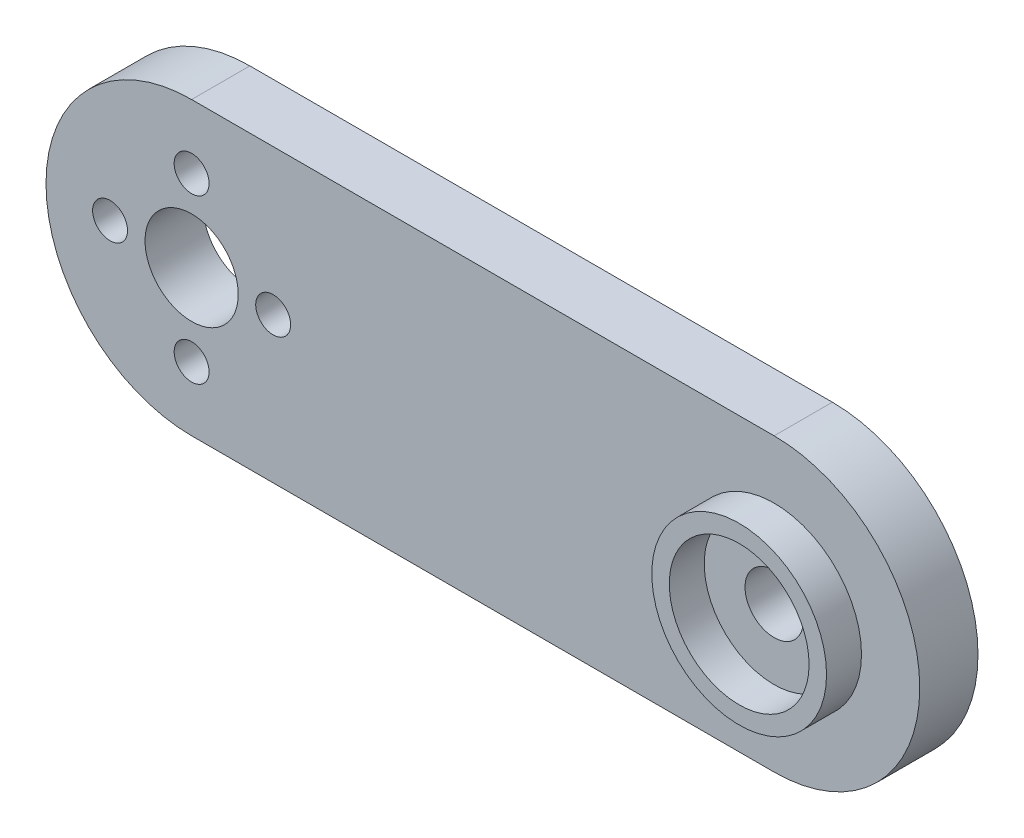
ISO-10303-21;
HEADER;
FILE_DESCRIPTION(('STEP AP214'),'2;1');
FILE_NAME('part.step','',(''),(''),'','','');
FILE_SCHEMA(('AUTOMOTIVE_DESIGN { 1 0 10303 214 1 1 1 1 }'));
ENDSEC;
DATA;
#1=APPLICATION_CONTEXT('core data for automotive mechanical design processes');
#2=APPLICATION_PROTOCOL_DEFINITION('international standard','automotive_design',2000,#1);
#3=PRODUCT_CONTEXT('',#1,'mechanical');
#4=PRODUCT('Part','Part','',(#3));
#5=PRODUCT_RELATED_PRODUCT_CATEGORY('part','',(#4));
#6=PRODUCT_DEFINITION_FORMATION('','',#4);
#7=PRODUCT_DEFINITION_CONTEXT('part definition',#1,'design');
#8=PRODUCT_DEFINITION('design','',#6,#7);
#9=PRODUCT_DEFINITION_SHAPE('','',#8);
#10=(LENGTH_UNIT() NAMED_UNIT(*) SI_UNIT(.MILLI.,.METRE.));
#11=(NAMED_UNIT(*) PLANE_ANGLE_UNIT() SI_UNIT($,.RADIAN.));
#12=(NAMED_UNIT(*) SI_UNIT($,.STERADIAN.) SOLID_ANGLE_UNIT());
#13=UNCERTAINTY_MEASURE_WITH_UNIT(LENGTH_MEASURE(1.E-05),#10,'distance_accuracy_value','');
#14=(GEOMETRIC_REPRESENTATION_CONTEXT(3) GLOBAL_UNCERTAINTY_ASSIGNED_CONTEXT((#13)) GLOBAL_UNIT_ASSIGNED_CONTEXT((#10,
#11,#12)) REPRESENTATION_CONTEXT('',''));
#15=CARTESIAN_POINT('',(0.,0.,0.));
#16=DIRECTION('',(0.,0.,1.));
#17=DIRECTION('',(1.,0.,0.));
#18=AXIS2_PLACEMENT_3D('',#15,#16,#17);
#19=CARTESIAN_POINT('',(0.,0.,5.));
#20=DIRECTION('',(0.,0.,1.));
#21=DIRECTION('',(1.,0.,0.));
#22=AXIS2_PLACEMENT_3D('',#19,#20,#21);
#23=PLANE('',#22);
#24=CARTESIAN_POINT('',(50.,12.5,5.));
#25=DIRECTION('',(0.,0.,1.));
#26=DIRECTION('',(1.,0.,0.));
#27=AXIS2_PLACEMENT_3D('',#24,#25,#26);
#28=CIRCLE('',#27,2.49999999999999);
#29=CARTESIAN_POINT('',(52.5,12.5,5.));
#30=VERTEX_POINT('',#29);
#31=EDGE_CURVE('E159',#30,#30,#28,.T.);
#32=ORIENTED_EDGE('',*,*,#31,.F.);
#33=EDGE_LOOP('',(#32));
#34=FACE_BOUND('',#33,.T.);
#35=CARTESIAN_POINT('',(50.,12.5,5.));
#36=DIRECTION('',(0.,0.,1.));
#37=DIRECTION('',(1.,0.,0.));
#38=AXIS2_PLACEMENT_3D('',#35,#36,#37);
#39=CIRCLE('',#38,6.);
#40=CARTESIAN_POINT('',(56.,12.5,5.));
#41=VERTEX_POINT('',#40);
#42=EDGE_CURVE('E12',#41,#41,#39,.F.);
#43=ORIENTED_EDGE('',*,*,#42,.F.);
#44=EDGE_LOOP('',(#43));
#45=FACE_BOUND('',#44,.T.);
#46=ADVANCED_FACE('F76',(#34,#45),#23,.T.);
#47=CARTESIAN_POINT('',(0.,25.,5.));
#48=DIRECTION('',(0.,1.,0.));
#49=DIRECTION('',(-1.,0.,0.));
#50=AXIS2_PLACEMENT_3D('',#47,#48,#49);
#51=PLANE('',#50);
#52=DIRECTION('',(1.,0.,0.));
#53=VECTOR('',#52,1.);
#54=CARTESIAN_POINT('',(0.,25.,0.));
#55=LINE('',#54,#53);
#56=CARTESIAN_POINT('',(0.,25.,0.));
#57=VERTEX_POINT('',#56);
#58=CARTESIAN_POINT('',(50.,25.,0.));
#59=VERTEX_POINT('',#58);
#60=EDGE_CURVE('E145',#57,#59,#55,.T.);
#61=ORIENTED_EDGE('',*,*,#60,.F.);
#62=DIRECTION('',(0.,0.,-1.));
#63=VECTOR('',#62,1.);
#64=CARTESIAN_POINT('',(0.,25.,5.));
#65=LINE('',#64,#63);
#66=CARTESIAN_POINT('',(0.,25.,5.));
#67=VERTEX_POINT('',#66);
#68=EDGE_CURVE('E85',#67,#57,#65,.T.);
#69=ORIENTED_EDGE('',*,*,#68,.F.);
#70=DIRECTION('',(1.,0.,0.));
#71=VECTOR('',#70,1.);
#72=CARTESIAN_POINT('',(0.,25.,5.));
#73=LINE('',#72,#71);
#74=CARTESIAN_POINT('',(50.,25.,5.));
#75=VERTEX_POINT('',#74);
#76=EDGE_CURVE('E139',#67,#75,#73,.T.);
#77=ORIENTED_EDGE('',*,*,#76,.T.);
#78=DIRECTION('',(0.,0.,-1.));
#79=VECTOR('',#78,1.);
#80=CARTESIAN_POINT('',(50.,25.,5.));
#81=LINE('',#80,#79);
#82=EDGE_CURVE('E119',#75,#59,#81,.T.);
#83=ORIENTED_EDGE('',*,*,#82,.T.);
#84=EDGE_LOOP('',(#61,#69,#77,#83));
#85=FACE_BOUND('',#84,.T.);
#86=ADVANCED_FACE('F174',(#85),#51,.T.);
#87=CARTESIAN_POINT('',(0.,0.,5.));
#88=DIRECTION('',(0.,1.,0.));
#89=DIRECTION('',(0.,0.,1.));
#90=AXIS2_PLACEMENT_3D('',#87,#88,#89);
#91=PLANE('',#90);
#92=DIRECTION('',(1.,0.,0.));
#93=VECTOR('',#92,1.);
#94=CARTESIAN_POINT('',(0.,0.,0.));
#95=LINE('',#94,#93);
#96=CARTESIAN_POINT('',(0.,0.,0.));
#97=VERTEX_POINT('',#96);
#98=CARTESIAN_POINT('',(50.,0.,0.));
#99=VERTEX_POINT('',#98);
#100=EDGE_CURVE('E127',#97,#99,#95,.T.);
#101=ORIENTED_EDGE('',*,*,#100,.T.);
#102=DIRECTION('',(0.,0.,-1.));
#103=VECTOR('',#102,1.);
#104=CARTESIAN_POINT('',(50.,0.,5.));
#105=LINE('',#104,#103);
#106=CARTESIAN_POINT('',(50.,0.,5.));
#107=VERTEX_POINT('',#106);
#108=EDGE_CURVE('E122',#107,#99,#105,.T.);
#109=ORIENTED_EDGE('',*,*,#108,.F.);
#110=DIRECTION('',(1.,0.,0.));
#111=VECTOR('',#110,1.);
#112=CARTESIAN_POINT('',(0.,0.,5.));
#113=LINE('',#112,#111);
#114=CARTESIAN_POINT('',(0.,0.,5.));
#115=VERTEX_POINT('',#114);
#116=EDGE_CURVE('E125',#115,#107,#113,.T.);
#117=ORIENTED_EDGE('',*,*,#116,.F.);
#118=DIRECTION('',(0.,0.,-1.));
#119=VECTOR('',#118,1.);
#120=CARTESIAN_POINT('',(0.,0.,5.));
#121=LINE('',#120,#119);
#122=EDGE_CURVE('E109',#115,#97,#121,.T.);
#123=ORIENTED_EDGE('',*,*,#122,.T.);
#124=EDGE_LOOP('',(#101,#109,#117,#123));
#125=FACE_BOUND('',#124,.T.);
#126=ADVANCED_FACE('F123',(#125),#91,.F.);
#127=CARTESIAN_POINT('',(0.,0.,0.));
#128=DIRECTION('',(0.,0.,1.));
#129=DIRECTION('',(1.,0.,0.));
#130=AXIS2_PLACEMENT_3D('',#127,#128,#129);
#131=PLANE('',#130);
#132=CARTESIAN_POINT('',(-7.,12.5,0.));
#133=DIRECTION('',(0.,0.,1.));
#134=DIRECTION('',(1.,0.,0.));
#135=AXIS2_PLACEMENT_3D('',#132,#133,#134);
#136=CIRCLE('',#135,1.5);
#137=CARTESIAN_POINT('',(-5.5,12.5,0.));
#138=VERTEX_POINT('',#137);
#139=EDGE_CURVE('E335',#138,#138,#136,.F.);
#140=ORIENTED_EDGE('',*,*,#139,.F.);
#141=EDGE_LOOP('',(#140));
#142=FACE_BOUND('',#141,.T.);
#143=CARTESIAN_POINT('',(0.,19.5,0.));
#144=DIRECTION('',(0.,0.,1.));
#145=DIRECTION('',(1.,0.,0.));
#146=AXIS2_PLACEMENT_3D('',#143,#144,#145);
#147=CIRCLE('',#146,1.5);
#148=CARTESIAN_POINT('',(1.5,19.5,0.));
#149=VERTEX_POINT('',#148);
#150=EDGE_CURVE('E340',#149,#149,#147,.F.);
#151=ORIENTED_EDGE('',*,*,#150,.F.);
#152=EDGE_LOOP('',(#151));
#153=FACE_BOUND('',#152,.T.);
#154=CARTESIAN_POINT('',(7.,12.5,0.));
#155=DIRECTION('',(0.,0.,1.));
#156=DIRECTION('',(1.,0.,0.));
#157=AXIS2_PLACEMENT_3D('',#154,#155,#156);
#158=CIRCLE('',#157,1.5);
#159=CARTESIAN_POINT('',(8.5,12.5,0.));
#160=VERTEX_POINT('',#159);
#161=EDGE_CURVE('E346',#160,#160,#158,.F.);
#162=ORIENTED_EDGE('',*,*,#161,.F.);
#163=EDGE_LOOP('',(#162));
#164=FACE_BOUND('',#163,.T.);
#165=CARTESIAN_POINT('',(0.,5.5,0.));
#166=DIRECTION('',(0.,0.,1.));
#167=DIRECTION('',(1.,0.,0.));
#168=AXIS2_PLACEMENT_3D('',#165,#166,#167);
#169=CIRCLE('',#168,1.5);
#170=CARTESIAN_POINT('',(1.5,5.5,0.));
#171=VERTEX_POINT('',#170);
#172=EDGE_CURVE('E352',#171,#171,#169,.F.);
#173=ORIENTED_EDGE('',*,*,#172,.F.);
#174=EDGE_LOOP('',(#173));
#175=FACE_BOUND('',#174,.T.);
#176=CARTESIAN_POINT('',(0.,12.5,0.));
#177=DIRECTION('',(0.,0.,1.));
#178=DIRECTION('',(1.,0.,0.));
#179=AXIS2_PLACEMENT_3D('',#176,#177,#178);
#180=CIRCLE('',#179,4.);
#181=CARTESIAN_POINT('',(4.,12.5,0.));
#182=VERTEX_POINT('',#181);
#183=EDGE_CURVE('E152',#182,#182,#180,.F.);
#184=ORIENTED_EDGE('',*,*,#183,.F.);
#185=EDGE_LOOP('',(#184));
#186=FACE_BOUND('',#185,.T.);
#187=CARTESIAN_POINT('',(50.,12.5,0.));
#188=DIRECTION('',(0.,0.,1.));
#189=DIRECTION('',(1.,0.,0.));
#190=AXIS2_PLACEMENT_3D('',#187,#188,#189);
#191=CIRCLE('',#190,2.49999999999999);
#192=CARTESIAN_POINT('',(52.5,12.5,0.));
#193=VERTEX_POINT('',#192);
#194=EDGE_CURVE('E163',#193,#193,#191,.F.);
#195=ORIENTED_EDGE('',*,*,#194,.F.);
#196=EDGE_LOOP('',(#195));
#197=FACE_BOUND('',#196,.T.);
#198=ORIENTED_EDGE('',*,*,#100,.F.);
#199=CARTESIAN_POINT('',(0.,12.5,0.));
#200=DIRECTION('',(0.,0.,1.));
#201=DIRECTION('',(1.,0.,0.));
#202=AXIS2_PLACEMENT_3D('',#199,#200,#201);
#203=CIRCLE('',#202,12.5);
#204=EDGE_CURVE('E133',#57,#97,#203,.T.);
#205=ORIENTED_EDGE('',*,*,#204,.F.);
#206=ORIENTED_EDGE('',*,*,#60,.T.);
#207=CARTESIAN_POINT('',(50.,12.5,0.));
#208=DIRECTION('',(0.,0.,1.));
#209=DIRECTION('',(1.,0.,0.));
#210=AXIS2_PLACEMENT_3D('',#207,#208,#209);
#211=CIRCLE('',#210,12.5);
#212=EDGE_CURVE('E134',#99,#59,#211,.T.);
#213=ORIENTED_EDGE('',*,*,#212,.F.);
#214=EDGE_LOOP('',(#198,#205,#206,#213));
#215=FACE_BOUND('',#214,.T.);
#216=ADVANCED_FACE('F201',(#142,#153,#164,#175,#186,#197,#215),#131,.F.);
#217=CARTESIAN_POINT('',(-7.,12.5,5.));
#218=DIRECTION('',(0.,0.,1.));
#219=DIRECTION('',(1.,0.,0.));
#220=AXIS2_PLACEMENT_3D('',#217,#218,#219);
#221=CIRCLE('',#220,1.5);
#222=CARTESIAN_POINT('',(-5.5,12.5,5.));
#223=VERTEX_POINT('',#222);
#224=EDGE_CURVE('E332',#223,#223,#221,.T.);
#225=ORIENTED_EDGE('',*,*,#224,.F.);
#226=EDGE_LOOP('',(#225));
#227=FACE_BOUND('',#226,.T.);
#228=CARTESIAN_POINT('',(0.,19.5,5.));
#229=DIRECTION('',(0.,0.,1.));
#230=DIRECTION('',(1.,0.,0.));
#231=AXIS2_PLACEMENT_3D('',#228,#229,#230);
#232=CIRCLE('',#231,1.5);
#233=CARTESIAN_POINT('',(1.5,19.5,5.));
#234=VERTEX_POINT('',#233);
#235=EDGE_CURVE('E343',#234,#234,#232,.T.);
#236=ORIENTED_EDGE('',*,*,#235,.F.);
#237=EDGE_LOOP('',(#236));
#238=FACE_BOUND('',#237,.T.);
#239=CARTESIAN_POINT('',(7.,12.5,5.));
#240=DIRECTION('',(0.,0.,1.));
#241=DIRECTION('',(1.,0.,0.));
#242=AXIS2_PLACEMENT_3D('',#239,#240,#241);
#243=CIRCLE('',#242,1.5);
#244=CARTESIAN_POINT('',(8.5,12.5,5.));
#245=VERTEX_POINT('',#244);
#246=EDGE_CURVE('E349',#245,#245,#243,.T.);
#247=ORIENTED_EDGE('',*,*,#246,.F.);
#248=EDGE_LOOP('',(#247));
#249=FACE_BOUND('',#248,.T.);
#250=CARTESIAN_POINT('',(0.,5.5,5.));
#251=DIRECTION('',(0.,0.,1.));
#252=DIRECTION('',(1.,0.,0.));
#253=AXIS2_PLACEMENT_3D('',#250,#251,#252);
#254=CIRCLE('',#253,1.5);
#255=CARTESIAN_POINT('',(1.5,5.5,5.));
#256=VERTEX_POINT('',#255);
#257=EDGE_CURVE('E355',#256,#256,#254,.T.);
#258=ORIENTED_EDGE('',*,*,#257,.F.);
#259=EDGE_LOOP('',(#258));
#260=FACE_BOUND('',#259,.T.);
#261=CARTESIAN_POINT('',(50.,12.5,5.));
#262=DIRECTION('',(0.,0.,1.));
#263=DIRECTION('',(1.,0.,0.));
#264=AXIS2_PLACEMENT_3D('',#261,#262,#263);
#265=CIRCLE('',#264,7.50000000000001);
#266=CARTESIAN_POINT('',(57.5,12.5,5.));
#267=VERTEX_POINT('',#266);
#268=EDGE_CURVE('E336',#267,#267,#265,.T.);
#269=ORIENTED_EDGE('',*,*,#268,.F.);
#270=EDGE_LOOP('',(#269));
#271=FACE_BOUND('',#270,.T.);
#272=CARTESIAN_POINT('',(0.,12.5,5.));
#273=DIRECTION('',(0.,0.,1.));
#274=DIRECTION('',(1.,0.,0.));
#275=AXIS2_PLACEMENT_3D('',#272,#273,#274);
#276=CIRCLE('',#275,4.);
#277=CARTESIAN_POINT('',(4.,12.5,5.));
#278=VERTEX_POINT('',#277);
#279=EDGE_CURVE('E154',#278,#278,#276,.T.);
#280=ORIENTED_EDGE('',*,*,#279,.F.);
#281=EDGE_LOOP('',(#280));
#282=FACE_BOUND('',#281,.T.);
#283=ORIENTED_EDGE('',*,*,#76,.F.);
#284=CARTESIAN_POINT('',(0.,12.5,5.));
#285=DIRECTION('',(0.,0.,1.));
#286=DIRECTION('',(1.,0.,0.));
#287=AXIS2_PLACEMENT_3D('',#284,#285,#286);
#288=CIRCLE('',#287,12.5);
#289=EDGE_CURVE('E138',#67,#115,#288,.T.);
#290=ORIENTED_EDGE('',*,*,#289,.T.);
#291=ORIENTED_EDGE('',*,*,#116,.T.);
#292=CARTESIAN_POINT('',(50.,12.5,5.));
#293=DIRECTION('',(0.,0.,1.));
#294=DIRECTION('',(1.,0.,0.));
#295=AXIS2_PLACEMENT_3D('',#292,#293,#294);
#296=CIRCLE('',#295,12.5);
#297=EDGE_CURVE('E130',#107,#75,#296,.T.);
#298=ORIENTED_EDGE('',*,*,#297,.T.);
#299=EDGE_LOOP('',(#283,#290,#291,#298));
#300=FACE_BOUND('',#299,.T.);
#301=ADVANCED_FACE('F137',(#227,#238,#249,#260,#271,#282,#300),#23,.T.);
#302=CARTESIAN_POINT('',(50.,12.5,5.));
#303=DIRECTION('',(0.,0.,-1.));
#304=DIRECTION('',(-1.,0.,0.));
#305=AXIS2_PLACEMENT_3D('',#302,#303,#304);
#306=CYLINDRICAL_SURFACE('',#305,12.5);
#307=ORIENTED_EDGE('',*,*,#212,.T.);
#308=ORIENTED_EDGE('',*,*,#82,.F.);
#309=ORIENTED_EDGE('',*,*,#297,.F.);
#310=ORIENTED_EDGE('',*,*,#108,.T.);
#311=EDGE_LOOP('',(#307,#308,#309,#310));
#312=FACE_BOUND('',#311,.T.);
#313=ADVANCED_FACE('F78',(#312),#306,.T.);
#314=CARTESIAN_POINT('',(0.,12.5,5.));
#315=DIRECTION('',(0.,0.,-1.));
#316=DIRECTION('',(-1.,0.,0.));
#317=AXIS2_PLACEMENT_3D('',#314,#315,#316);
#318=CYLINDRICAL_SURFACE('',#317,12.5);
#319=ORIENTED_EDGE('',*,*,#68,.T.);
#320=ORIENTED_EDGE('',*,*,#204,.T.);
#321=ORIENTED_EDGE('',*,*,#122,.F.);
#322=ORIENTED_EDGE('',*,*,#289,.F.);
#323=EDGE_LOOP('',(#319,#320,#321,#322));
#324=FACE_BOUND('',#323,.T.);
#325=ADVANCED_FACE('F198',(#324),#318,.T.);
#326=CARTESIAN_POINT('',(50.,12.5,-0.00100000000000013));
#327=DIRECTION('',(0.,0.,1.));
#328=DIRECTION('',(1.,0.,0.));
#329=AXIS2_PLACEMENT_3D('',#326,#327,#328);
#330=CYLINDRICAL_SURFACE('',#329,2.49999999999999);
#331=ORIENTED_EDGE('',*,*,#31,.T.);
#332=EDGE_LOOP('',(#331));
#333=FACE_BOUND('',#332,.T.);
#334=ORIENTED_EDGE('',*,*,#194,.T.);
#335=EDGE_LOOP('',(#334));
#336=FACE_BOUND('',#335,.T.);
#337=ADVANCED_FACE('F169',(#333,#336),#330,.F.);
#338=CARTESIAN_POINT('',(0.,12.5,-0.00100000000000013));
#339=DIRECTION('',(0.,0.,1.));
#340=DIRECTION('',(1.,0.,0.));
#341=AXIS2_PLACEMENT_3D('',#338,#339,#340);
#342=CYLINDRICAL_SURFACE('',#341,4.);
#343=ORIENTED_EDGE('',*,*,#279,.T.);
#344=EDGE_LOOP('',(#343));
#345=FACE_BOUND('',#344,.T.);
#346=ORIENTED_EDGE('',*,*,#183,.T.);
#347=EDGE_LOOP('',(#346));
#348=FACE_BOUND('',#347,.T.);
#349=ADVANCED_FACE('F181',(#345,#348),#342,.F.);
#350=CARTESIAN_POINT('',(50.,12.5,8.));
#351=DIRECTION('',(0.,0.,-1.));
#352=DIRECTION('',(-1.,0.,0.));
#353=AXIS2_PLACEMENT_3D('',#350,#351,#352);
#354=CYLINDRICAL_SURFACE('',#353,6.);
#355=CARTESIAN_POINT('',(50.,12.5,8.));
#356=DIRECTION('',(0.,0.,1.));
#357=DIRECTION('',(1.,0.,0.));
#358=AXIS2_PLACEMENT_3D('',#355,#356,#357);
#359=CIRCLE('',#358,6.);
#360=CARTESIAN_POINT('',(56.,12.5,8.));
#361=VERTEX_POINT('',#360);
#362=EDGE_CURVE('E339',#361,#361,#359,.T.);
#363=ORIENTED_EDGE('',*,*,#362,.T.);
#364=EDGE_LOOP('',(#363));
#365=FACE_BOUND('',#364,.T.);
#366=ORIENTED_EDGE('',*,*,#42,.T.);
#367=EDGE_LOOP('',(#366));
#368=FACE_BOUND('',#367,.T.);
#369=ADVANCED_FACE('F178',(#365,#368),#354,.F.);
#370=CARTESIAN_POINT('',(50.,12.5,8.));
#371=DIRECTION('',(0.,0.,-1.));
#372=DIRECTION('',(-1.,0.,0.));
#373=AXIS2_PLACEMENT_3D('',#370,#371,#372);
#374=CYLINDRICAL_SURFACE('',#373,7.50000000000001);
#375=CARTESIAN_POINT('',(50.,12.5,8.));
#376=DIRECTION('',(0.,0.,1.));
#377=DIRECTION('',(1.,0.,0.));
#378=AXIS2_PLACEMENT_3D('',#375,#376,#377);
#379=CIRCLE('',#378,7.50000000000001);
#380=CARTESIAN_POINT('',(57.5,12.5,8.));
#381=VERTEX_POINT('',#380);
#382=EDGE_CURVE('E165',#381,#381,#379,.T.);
#383=ORIENTED_EDGE('',*,*,#382,.F.);
#384=EDGE_LOOP('',(#383));
#385=FACE_BOUND('',#384,.T.);
#386=ORIENTED_EDGE('',*,*,#268,.T.);
#387=EDGE_LOOP('',(#386));
#388=FACE_BOUND('',#387,.T.);
#389=ADVANCED_FACE('F180',(#385,#388),#374,.T.);
#390=CARTESIAN_POINT('',(0.,0.,8.));
#391=DIRECTION('',(0.,0.,1.));
#392=DIRECTION('',(1.,0.,0.));
#393=AXIS2_PLACEMENT_3D('',#390,#391,#392);
#394=PLANE('',#393);
#395=ORIENTED_EDGE('',*,*,#362,.F.);
#396=EDGE_LOOP('',(#395));
#397=FACE_BOUND('',#396,.T.);
#398=ORIENTED_EDGE('',*,*,#382,.T.);
#399=EDGE_LOOP('',(#398));
#400=FACE_BOUND('',#399,.T.);
#401=ADVANCED_FACE('F188',(#397,#400),#394,.T.);
#402=CARTESIAN_POINT('',(0.,5.5,-0.00100000000000013));
#403=DIRECTION('',(0.,0.,1.));
#404=DIRECTION('',(1.,0.,0.));
#405=AXIS2_PLACEMENT_3D('',#402,#403,#404);
#406=CYLINDRICAL_SURFACE('',#405,1.5);
#407=ORIENTED_EDGE('',*,*,#257,.T.);
#408=EDGE_LOOP('',(#407));
#409=FACE_BOUND('',#408,.T.);
#410=ORIENTED_EDGE('',*,*,#172,.T.);
#411=EDGE_LOOP('',(#410));
#412=FACE_BOUND('',#411,.T.);
#413=ADVANCED_FACE('F288',(#409,#412),#406,.F.);
#414=CARTESIAN_POINT('',(7.,12.5,-0.00100000000000013));
#415=DIRECTION('',(0.,0.,1.));
#416=DIRECTION('',(1.,0.,0.));
#417=AXIS2_PLACEMENT_3D('',#414,#415,#416);
#418=CYLINDRICAL_SURFACE('',#417,1.5);
#419=ORIENTED_EDGE('',*,*,#246,.T.);
#420=EDGE_LOOP('',(#419));
#421=FACE_BOUND('',#420,.T.);
#422=ORIENTED_EDGE('',*,*,#161,.T.);
#423=EDGE_LOOP('',(#422));
#424=FACE_BOUND('',#423,.T.);
#425=ADVANCED_FACE('F296',(#421,#424),#418,.F.);
#426=CARTESIAN_POINT('',(0.,19.5,-0.00100000000000013));
#427=DIRECTION('',(0.,0.,1.));
#428=DIRECTION('',(1.,0.,0.));
#429=AXIS2_PLACEMENT_3D('',#426,#427,#428);
#430=CYLINDRICAL_SURFACE('',#429,1.5);
#431=ORIENTED_EDGE('',*,*,#235,.T.);
#432=EDGE_LOOP('',(#431));
#433=FACE_BOUND('',#432,.T.);
#434=ORIENTED_EDGE('',*,*,#150,.T.);
#435=EDGE_LOOP('',(#434));
#436=FACE_BOUND('',#435,.T.);
#437=ADVANCED_FACE('F306',(#433,#436),#430,.F.);
#438=CARTESIAN_POINT('',(-7.,12.5,-0.00100000000000013));
#439=DIRECTION('',(0.,0.,1.));
#440=DIRECTION('',(1.,0.,0.));
#441=AXIS2_PLACEMENT_3D('',#438,#439,#440);
#442=CYLINDRICAL_SURFACE('',#441,1.5);
#443=ORIENTED_EDGE('',*,*,#224,.T.);
#444=EDGE_LOOP('',(#443));
#445=FACE_BOUND('',#444,.T.);
#446=ORIENTED_EDGE('',*,*,#139,.T.);
#447=EDGE_LOOP('',(#446));
#448=FACE_BOUND('',#447,.T.);
#449=ADVANCED_FACE('F316',(#445,#448),#442,.F.);
#450=CLOSED_SHELL('',(#46,#86,#126,#216,#301,#313,#325,#337,#349,#369,#389,#401,#413,#425,#437,#449));
#451=MANIFOLD_SOLID_BREP('B2',#450);
#452=ADVANCED_BREP_SHAPE_REPRESENTATION('',(#18,#451),#14);
#453=SHAPE_DEFINITION_REPRESENTATION(#9,#452);
ENDSEC;
END-ISO-10303-21;
